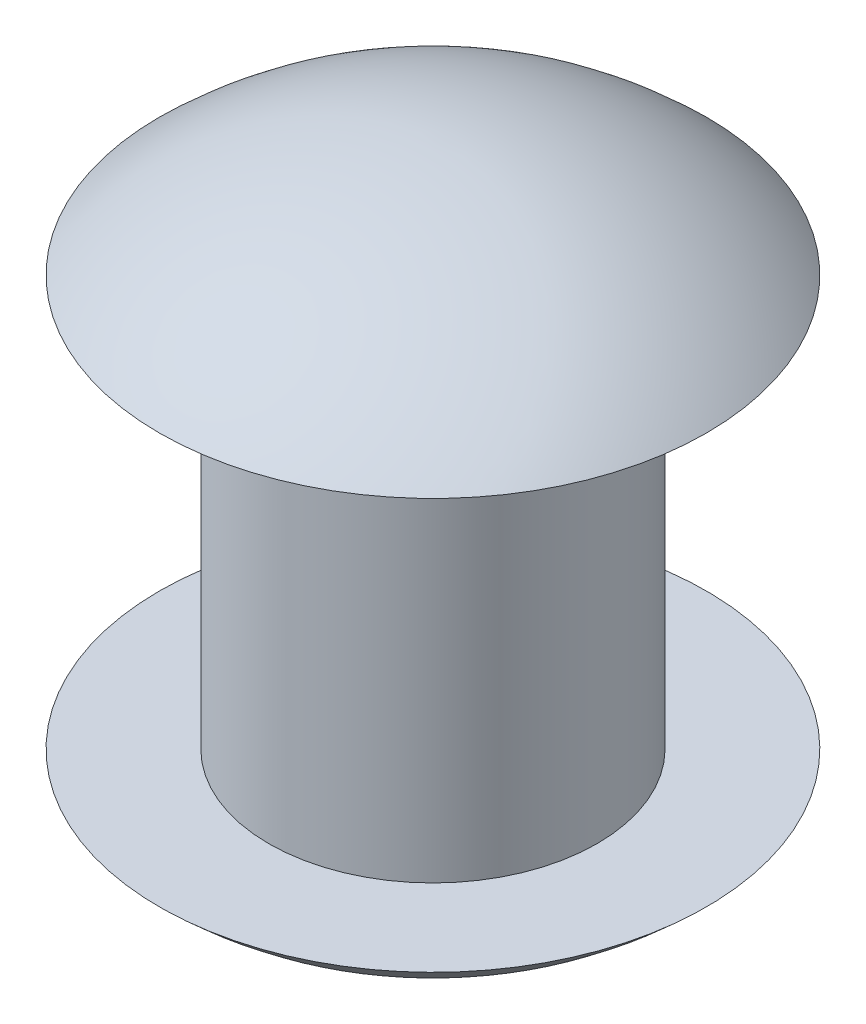
ISO-10303-21;
HEADER;
FILE_DESCRIPTION(('STEP AP214'),'2;1');
FILE_NAME('part.step','',(''),(''),'','','');
FILE_SCHEMA(('AUTOMOTIVE_DESIGN { 1 0 10303 214 1 1 1 1 }'));
ENDSEC;
DATA;
#1=APPLICATION_CONTEXT('core data for automotive mechanical design processes');
#2=APPLICATION_PROTOCOL_DEFINITION('international standard','automotive_design',2000,#1);
#3=PRODUCT_CONTEXT('',#1,'mechanical');
#4=PRODUCT('Part','Part','',(#3));
#5=PRODUCT_RELATED_PRODUCT_CATEGORY('part','',(#4));
#6=PRODUCT_DEFINITION_FORMATION('','',#4);
#7=PRODUCT_DEFINITION_CONTEXT('part definition',#1,'design');
#8=PRODUCT_DEFINITION('design','',#6,#7);
#9=PRODUCT_DEFINITION_SHAPE('','',#8);
#10=(LENGTH_UNIT() NAMED_UNIT(*) SI_UNIT(.MILLI.,.METRE.));
#11=(NAMED_UNIT(*) PLANE_ANGLE_UNIT() SI_UNIT($,.RADIAN.));
#12=(NAMED_UNIT(*) SI_UNIT($,.STERADIAN.) SOLID_ANGLE_UNIT());
#13=UNCERTAINTY_MEASURE_WITH_UNIT(LENGTH_MEASURE(1.E-05),#10,'distance_accuracy_value','');
#14=(GEOMETRIC_REPRESENTATION_CONTEXT(3) GLOBAL_UNCERTAINTY_ASSIGNED_CONTEXT((#13)) GLOBAL_UNIT_ASSIGNED_CONTEXT((#10,
#11,#12)) REPRESENTATION_CONTEXT('',''));
#15=CARTESIAN_POINT('',(0.,0.,0.));
#16=DIRECTION('',(0.,0.,1.));
#17=DIRECTION('',(1.,0.,0.));
#18=AXIS2_PLACEMENT_3D('',#15,#16,#17);
#19=CARTESIAN_POINT('',(0.,5.75,0.));
#20=DIRECTION('',(0.,1.,0.));
#21=DIRECTION('',(-1.,0.,0.));
#22=AXIS2_PLACEMENT_3D('',#19,#20,#21);
#23=CYLINDRICAL_SURFACE('',#22,3.);
#24=CARTESIAN_POINT('',(0.,3.75,0.));
#25=DIRECTION('',(0.,1.,0.));
#26=DIRECTION('',(-1.,0.,0.));
#27=AXIS2_PLACEMENT_3D('',#24,#25,#26);
#28=CIRCLE('',#27,3.);
#29=CARTESIAN_POINT('',(-3.,3.75,0.));
#30=VERTEX_POINT('',#29);
#31=EDGE_CURVE('E48',#30,#30,#28,.T.);
#32=ORIENTED_EDGE('',*,*,#31,.F.);
#33=EDGE_LOOP('',(#32));
#34=FACE_BOUND('',#33,.T.);
#35=CARTESIAN_POINT('',(0.,-3.75,0.));
#36=DIRECTION('',(0.,1.,0.));
#37=DIRECTION('',(-1.,0.,0.));
#38=AXIS2_PLACEMENT_3D('',#35,#36,#37);
#39=CIRCLE('',#38,3.);
#40=CARTESIAN_POINT('',(-3.,-3.75,0.));
#41=VERTEX_POINT('',#40);
#42=EDGE_CURVE('E10',#41,#41,#39,.T.);
#43=ORIENTED_EDGE('',*,*,#42,.T.);
#44=EDGE_LOOP('',(#43));
#45=FACE_BOUND('',#44,.T.);
#46=ADVANCED_FACE('F34',(#34,#45),#23,.T.);
#47=CARTESIAN_POINT('',(3.,-3.75,0.));
#48=DIRECTION('',(0.,-1.,0.));
#49=DIRECTION('',(1.,0.,0.));
#50=AXIS2_PLACEMENT_3D('',#47,#48,#49);
#51=PLANE('',#50);
#52=ORIENTED_EDGE('',*,*,#42,.F.);
#53=EDGE_LOOP('',(#52));
#54=FACE_BOUND('',#53,.T.);
#55=CARTESIAN_POINT('',(0.,-3.75,0.));
#56=DIRECTION('',(0.,1.,0.));
#57=DIRECTION('',(-1.,0.,0.));
#58=AXIS2_PLACEMENT_3D('',#55,#56,#57);
#59=CIRCLE('',#58,5.);
#60=CARTESIAN_POINT('',(-5.,-3.75,0.));
#61=VERTEX_POINT('',#60);
#62=EDGE_CURVE('E40',#61,#61,#59,.T.);
#63=ORIENTED_EDGE('',*,*,#62,.T.);
#64=EDGE_LOOP('',(#63));
#65=FACE_BOUND('',#64,.T.);
#66=ADVANCED_FACE('F57',(#54,#65),#51,.F.);
#67=CARTESIAN_POINT('',(0.,1.5,0.));
#68=DIRECTION('',(0.,1.,0.));
#69=DIRECTION('',(-1.,0.,0.));
#70=AXIS2_PLACEMENT_3D('',#67,#68,#69);
#71=SPHERICAL_SURFACE('',#70,7.25);
#72=ORIENTED_EDGE('',*,*,#62,.F.);
#73=EDGE_LOOP('',(#72));
#74=FACE_BOUND('',#73,.T.);
#75=ADVANCED_FACE('F61',(#74),#71,.T.);
#76=CARTESIAN_POINT('',(0.,-1.5,0.));
#77=DIRECTION('',(0.,1.,0.));
#78=DIRECTION('',(1.,0.,0.));
#79=AXIS2_PLACEMENT_3D('',#76,#77,#78);
#80=SPHERICAL_SURFACE('',#79,7.25);
#81=CARTESIAN_POINT('',(0.,3.75,0.));
#82=DIRECTION('',(0.,1.,0.));
#83=DIRECTION('',(-1.,0.,0.));
#84=AXIS2_PLACEMENT_3D('',#81,#82,#83);
#85=CIRCLE('',#84,5.);
#86=CARTESIAN_POINT('',(-5.,3.75,0.));
#87=VERTEX_POINT('',#86);
#88=EDGE_CURVE('E44',#87,#87,#85,.T.);
#89=ORIENTED_EDGE('',*,*,#88,.T.);
#90=EDGE_LOOP('',(#89));
#91=FACE_BOUND('',#90,.T.);
#92=ADVANCED_FACE('F66',(#91),#80,.T.);
#93=CARTESIAN_POINT('',(3.,3.75,0.));
#94=DIRECTION('',(0.,1.,0.));
#95=DIRECTION('',(-1.,0.,0.));
#96=AXIS2_PLACEMENT_3D('',#93,#94,#95);
#97=PLANE('',#96);
#98=ORIENTED_EDGE('',*,*,#88,.F.);
#99=EDGE_LOOP('',(#98));
#100=FACE_BOUND('',#99,.T.);
#101=ORIENTED_EDGE('',*,*,#31,.T.);
#102=EDGE_LOOP('',(#101));
#103=FACE_BOUND('',#102,.T.);
#104=ADVANCED_FACE('F54',(#100,#103),#97,.F.);
#105=CLOSED_SHELL('',(#46,#66,#75,#92,#104));
#106=MANIFOLD_SOLID_BREP('B2',#105);
#107=ADVANCED_BREP_SHAPE_REPRESENTATION('',(#18,#106),#14);
#108=SHAPE_DEFINITION_REPRESENTATION(#9,#107);
ENDSEC;
END-ISO-10303-21;
